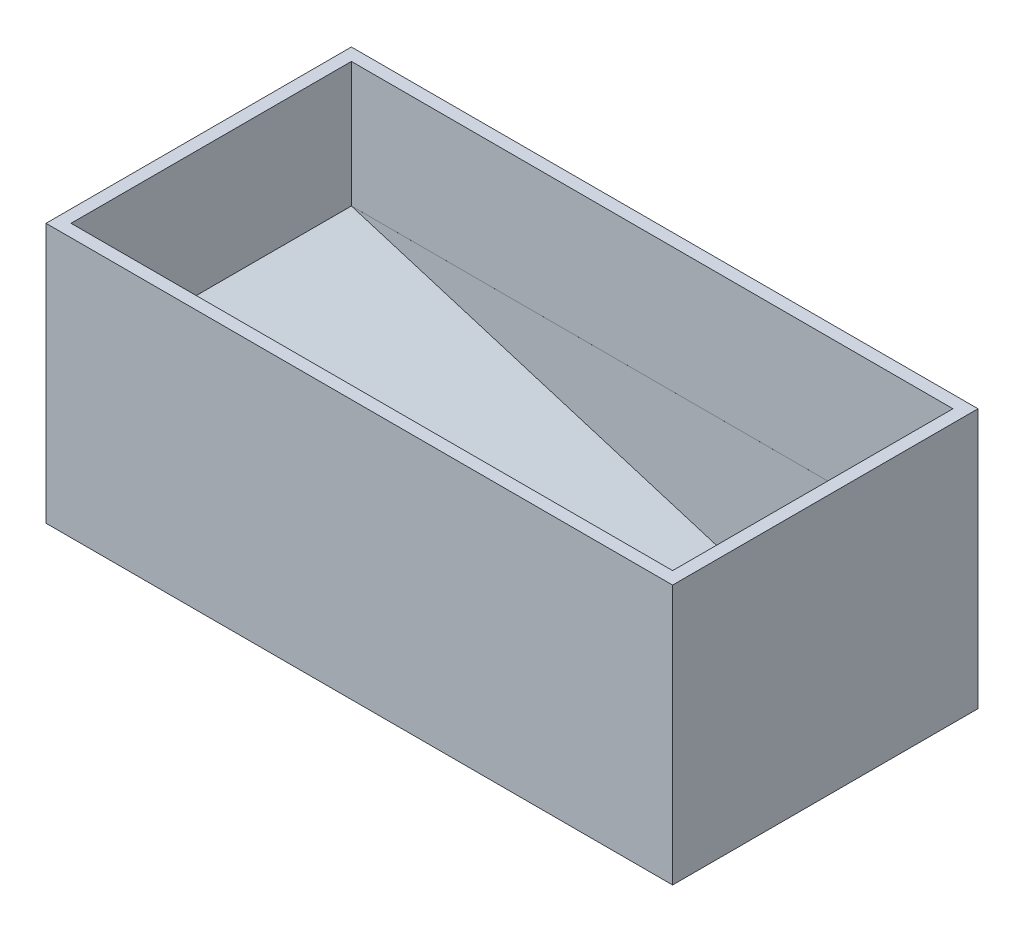
ISO-10303-21;
HEADER;
FILE_DESCRIPTION(('STEP AP214'),'2;1');
FILE_NAME('part.step','',(''),(''),'','','');
FILE_SCHEMA(('AUTOMOTIVE_DESIGN { 1 0 10303 214 1 1 1 1 }'));
ENDSEC;
DATA;
#1=APPLICATION_CONTEXT('core data for automotive mechanical design processes');
#2=APPLICATION_PROTOCOL_DEFINITION('international standard','automotive_design',2000,#1);
#3=PRODUCT_CONTEXT('',#1,'mechanical');
#4=PRODUCT('Part','Part','',(#3));
#5=PRODUCT_RELATED_PRODUCT_CATEGORY('part','',(#4));
#6=PRODUCT_DEFINITION_FORMATION('','',#4);
#7=PRODUCT_DEFINITION_CONTEXT('part definition',#1,'design');
#8=PRODUCT_DEFINITION('design','',#6,#7);
#9=PRODUCT_DEFINITION_SHAPE('','',#8);
#10=(LENGTH_UNIT() NAMED_UNIT(*) SI_UNIT(.MILLI.,.METRE.));
#11=(NAMED_UNIT(*) PLANE_ANGLE_UNIT() SI_UNIT($,.RADIAN.));
#12=(NAMED_UNIT(*) SI_UNIT($,.STERADIAN.) SOLID_ANGLE_UNIT());
#13=UNCERTAINTY_MEASURE_WITH_UNIT(LENGTH_MEASURE(1.E-05),#10,'distance_accuracy_value','');
#14=(GEOMETRIC_REPRESENTATION_CONTEXT(3) GLOBAL_UNCERTAINTY_ASSIGNED_CONTEXT((#13)) GLOBAL_UNIT_ASSIGNED_CONTEXT((#10,
#11,#12)) REPRESENTATION_CONTEXT('',''));
#15=CARTESIAN_POINT('',(0.,0.,0.));
#16=DIRECTION('',(0.,0.,1.));
#17=DIRECTION('',(1.,0.,0.));
#18=AXIS2_PLACEMENT_3D('',#15,#16,#17);
#19=CARTESIAN_POINT('',(0.,40.,-4.05));
#20=DIRECTION('',(0.300004064238839,0.953937923263447,0.));
#21=DIRECTION('',(-0.953937923263448,0.300004064238839,0.));
#22=AXIS2_PLACEMENT_3D('',#19,#20,#21);
#23=PLANE('',#22);
#24=DIRECTION('',(0.,0.,-1.));
#25=VECTOR('',#24,1.);
#26=CARTESIAN_POINT('',(120.8305,1.99999999999998,-83.58));
#27=LINE('',#26,#25);
#28=CARTESIAN_POINT('',(120.8305,1.99999999999999,-83.58));
#29=VERTEX_POINT('',#28);
#30=CARTESIAN_POINT('',(120.8305,1.99999999999998,-93.58));
#31=VERTEX_POINT('',#30);
#32=EDGE_CURVE('E48',#29,#31,#27,.T.);
#33=ORIENTED_EDGE('',*,*,#32,.F.);
#34=DIRECTION('',(-0.953937923263447,0.300004064238839,0.));
#35=VECTOR('',#34,1.);
#36=CARTESIAN_POINT('',(120.8305,1.99999999999998,-83.58));
#37=LINE('',#36,#35);
#38=CARTESIAN_POINT('',(127.19,0.,-83.58));
#39=VERTEX_POINT('',#38);
#40=EDGE_CURVE('E52',#39,#29,#37,.T.);
#41=ORIENTED_EDGE('',*,*,#40,.F.);
#42=DIRECTION('',(0.,0.,-1.));
#43=VECTOR('',#42,1.);
#44=CARTESIAN_POINT('',(127.19,0.,-4.05));
#45=LINE('',#44,#43);
#46=CARTESIAN_POINT('',(127.19,0.,-14.05));
#47=VERTEX_POINT('',#46);
#48=EDGE_CURVE('E222',#47,#39,#45,.T.);
#49=ORIENTED_EDGE('',*,*,#48,.F.);
#50=DIRECTION('',(0.953937923263447,-0.300004064238839,0.));
#51=VECTOR('',#50,1.);
#52=CARTESIAN_POINT('',(120.8305,2.,-14.05));
#53=LINE('',#52,#51);
#54=CARTESIAN_POINT('',(120.8305,2.,-14.05));
#55=VERTEX_POINT('',#54);
#56=EDGE_CURVE('E203',#55,#47,#53,.T.);
#57=ORIENTED_EDGE('',*,*,#56,.F.);
#58=DIRECTION('',(0.,0.,1.));
#59=VECTOR('',#58,1.);
#60=CARTESIAN_POINT('',(120.8305,2.,-14.05));
#61=LINE('',#60,#59);
#62=CARTESIAN_POINT('',(120.8305,2.,-4.05));
#63=VERTEX_POINT('',#62);
#64=EDGE_CURVE('E205',#55,#63,#61,.T.);
#65=ORIENTED_EDGE('',*,*,#64,.T.);
#66=DIRECTION('',(0.953937923263447,-0.300004064238839,0.));
#67=VECTOR('',#66,1.);
#68=CARTESIAN_POINT('',(0.,40.,-4.05));
#69=LINE('',#68,#67);
#70=CARTESIAN_POINT('',(0.,40.,-4.05));
#71=VERTEX_POINT('',#70);
#72=EDGE_CURVE('E218',#71,#63,#69,.T.);
#73=ORIENTED_EDGE('',*,*,#72,.F.);
#74=DIRECTION('',(0.,0.,-1.));
#75=VECTOR('',#74,1.);
#76=CARTESIAN_POINT('',(0.,40.,-4.05));
#77=LINE('',#76,#75);
#78=CARTESIAN_POINT('',(0.,40.,-93.58));
#79=VERTEX_POINT('',#78);
#80=EDGE_CURVE('E221',#71,#79,#77,.T.);
#81=ORIENTED_EDGE('',*,*,#80,.T.);
#82=DIRECTION('',(-0.953937923263447,0.300004064238839,0.));
#83=VECTOR('',#82,1.);
#84=CARTESIAN_POINT('',(0.,40.,-93.58));
#85=LINE('',#84,#83);
#86=EDGE_CURVE('E214',#31,#79,#85,.T.);
#87=ORIENTED_EDGE('',*,*,#86,.F.);
#88=EDGE_LOOP('',(#33,#41,#49,#57,#65,#73,#81,#87));
#89=FACE_BOUND('',#88,.T.);
#90=ADVANCED_FACE('F33',(#89),#23,.F.);
#91=CARTESIAN_POINT('',(-13.5001828907477,-2.92720654685515,-93.58));
#92=DIRECTION('',(0.,0.,-1.));
#93=DIRECTION('',(-1.,0.,0.));
#94=AXIS2_PLACEMENT_3D('',#91,#92,#93);
#95=PLANE('',#94);
#96=DIRECTION('',(-1.,0.,0.));
#97=VECTOR('',#96,1.);
#98=CARTESIAN_POINT('',(0.,1.99999999999998,-93.58));
#99=LINE('',#98,#97);
#100=CARTESIAN_POINT('',(0.,1.99999999999998,-93.58));
#101=VERTEX_POINT('',#100);
#102=EDGE_CURVE('E182',#31,#101,#99,.T.);
#103=ORIENTED_EDGE('',*,*,#102,.F.);
#104=ORIENTED_EDGE('',*,*,#86,.T.);
#105=DIRECTION('',(0.,-1.,0.));
#106=VECTOR('',#105,1.);
#107=CARTESIAN_POINT('',(0.,-2.92720654685515,-93.58));
#108=LINE('',#107,#106);
#109=EDGE_CURVE('E212',#79,#101,#108,.T.);
#110=ORIENTED_EDGE('',*,*,#109,.T.);
#111=EDGE_LOOP('',(#103,#104,#110));
#112=FACE_BOUND('',#111,.T.);
#113=ADVANCED_FACE('F378',(#112),#95,.F.);
#114=CARTESIAN_POINT('',(0.,0.,-4.05));
#115=DIRECTION('',(0.,0.,-1.));
#116=DIRECTION('',(-1.,0.,0.));
#117=AXIS2_PLACEMENT_3D('',#114,#115,#116);
#118=PLANE('',#117);
#119=ORIENTED_EDGE('',*,*,#72,.T.);
#120=DIRECTION('',(1.,0.,0.));
#121=VECTOR('',#120,1.);
#122=CARTESIAN_POINT('',(0.,2.,-4.05));
#123=LINE('',#122,#121);
#124=CARTESIAN_POINT('',(0.,2.,-4.05));
#125=VERTEX_POINT('',#124);
#126=EDGE_CURVE('E195',#125,#63,#123,.T.);
#127=ORIENTED_EDGE('',*,*,#126,.F.);
#128=DIRECTION('',(0.,1.,0.));
#129=VECTOR('',#128,1.);
#130=CARTESIAN_POINT('',(0.,0.,-4.05));
#131=LINE('',#130,#129);
#132=EDGE_CURVE('E216',#125,#71,#131,.T.);
#133=ORIENTED_EDGE('',*,*,#132,.T.);
#134=EDGE_LOOP('',(#119,#127,#133));
#135=FACE_BOUND('',#134,.T.);
#136=ADVANCED_FACE('F383',(#135),#118,.T.);
#137=CARTESIAN_POINT('',(0.,43.,0.));
#138=DIRECTION('',(0.,-1.,0.));
#139=DIRECTION('',(0.,0.,-1.));
#140=AXIS2_PLACEMENT_3D('',#137,#138,#139);
#141=PLANE('',#140);
#142=DIRECTION('',(0.,0.,1.));
#143=VECTOR('',#142,1.);
#144=CARTESIAN_POINT('',(196.209255975504,43.,-4.00494715810851));
#145=LINE('',#144,#143);
#146=CARTESIAN_POINT('',(196.209255975504,43.,-93.5820259850004));
#147=VERTEX_POINT('',#146);
#148=CARTESIAN_POINT('',(196.209255975504,43.,-93.58));
#149=VERTEX_POINT('',#148);
#150=EDGE_CURVE('E230',#147,#149,#145,.T.);
#151=ORIENTED_EDGE('',*,*,#150,.F.);
#152=DIRECTION('',(1.,0.,0.));
#153=VECTOR('',#152,1.);
#154=CARTESIAN_POINT('',(200.21,43.,-93.5820259850004));
#155=LINE('',#154,#153);
#156=CARTESIAN_POINT('',(3.99788742285523,43.,-93.5820259850004));
#157=VERTEX_POINT('',#156);
#158=EDGE_CURVE('E234',#157,#147,#155,.T.);
#159=ORIENTED_EDGE('',*,*,#158,.F.);
#160=DIRECTION('',(0.,0.,-1.));
#161=VECTOR('',#160,1.);
#162=CARTESIAN_POINT('',(3.99788742285523,43.,-4.00494715810851));
#163=LINE('',#162,#161);
#164=CARTESIAN_POINT('',(3.99788742285523,43.,-4.00494715810851));
#165=VERTEX_POINT('',#164);
#166=EDGE_CURVE('E238',#165,#157,#163,.T.);
#167=ORIENTED_EDGE('',*,*,#166,.F.);
#168=DIRECTION('',(-1.,0.,0.));
#169=VECTOR('',#168,1.);
#170=CARTESIAN_POINT('',(200.21,43.,-4.00494715810851));
#171=LINE('',#170,#169);
#172=CARTESIAN_POINT('',(4.,43.,-4.00494715810851));
#173=VERTEX_POINT('',#172);
#174=EDGE_CURVE('E263',#173,#165,#171,.T.);
#175=ORIENTED_EDGE('',*,*,#174,.F.);
#176=DIRECTION('',(0.,0.,1.));
#177=VECTOR('',#176,1.);
#178=CARTESIAN_POINT('',(4.,43.,-4.));
#179=LINE('',#178,#177);
#180=CARTESIAN_POINT('',(4.,43.,-93.58));
#181=VERTEX_POINT('',#180);
#182=EDGE_CURVE('E273',#181,#173,#179,.T.);
#183=ORIENTED_EDGE('',*,*,#182,.F.);
#184=DIRECTION('',(-1.,0.,0.));
#185=VECTOR('',#184,1.);
#186=CARTESIAN_POINT('',(135.19,43.,-93.58));
#187=LINE('',#186,#185);
#188=EDGE_CURVE('E291',#149,#181,#187,.T.);
#189=ORIENTED_EDGE('',*,*,#188,.F.);
#190=EDGE_LOOP('',(#151,#159,#167,#175,#183,#189));
#191=FACE_BOUND('',#190,.T.);
#192=ADVANCED_FACE('F336',(#191),#141,.F.);
#193=CARTESIAN_POINT('',(200.21,83.,-4.00494715810851));
#194=DIRECTION('',(0.,0.,1.));
#195=DIRECTION('',(1.,0.,0.));
#196=AXIS2_PLACEMENT_3D('',#193,#194,#195);
#197=PLANE('',#196);
#198=DIRECTION('',(0.,-1.,0.));
#199=VECTOR('',#198,1.);
#200=CARTESIAN_POINT('',(196.209255975504,83.,-4.00494715810851));
#201=LINE('',#200,#199);
#202=CARTESIAN_POINT('',(196.209255975504,83.,-4.00494715810851));
#203=VERTEX_POINT('',#202);
#204=CARTESIAN_POINT('',(196.209255975504,43.,-4.00494715810851));
#205=VERTEX_POINT('',#204);
#206=EDGE_CURVE('E229',#203,#205,#201,.T.);
#207=ORIENTED_EDGE('',*,*,#206,.T.);
#208=EDGE_CURVE('E250',#205,#173,#171,.T.);
#209=ORIENTED_EDGE('',*,*,#208,.T.);
#210=ORIENTED_EDGE('',*,*,#174,.T.);
#211=DIRECTION('',(0.,-1.,0.));
#212=VECTOR('',#211,1.);
#213=CARTESIAN_POINT('',(3.99788742285523,83.,-4.00494715810851));
#214=LINE('',#213,#212);
#215=CARTESIAN_POINT('',(3.99788742285523,83.,-4.00494715810851));
#216=VERTEX_POINT('',#215);
#217=EDGE_CURVE('E246',#216,#165,#214,.T.);
#218=ORIENTED_EDGE('',*,*,#217,.F.);
#219=DIRECTION('',(-1.,0.,0.));
#220=VECTOR('',#219,1.);
#221=CARTESIAN_POINT('',(200.21,83.,-4.00494715810851));
#222=LINE('',#221,#220);
#223=EDGE_CURVE('E253',#203,#216,#222,.T.);
#224=ORIENTED_EDGE('',*,*,#223,.F.);
#225=EDGE_LOOP('',(#207,#209,#210,#218,#224));
#226=FACE_BOUND('',#225,.T.);
#227=ADVANCED_FACE('F329',(#226),#197,.F.);
#228=CARTESIAN_POINT('',(200.21,83.,-93.5820259850004));
#229=DIRECTION('',(0.,0.,-1.));
#230=DIRECTION('',(-1.,0.,0.));
#231=AXIS2_PLACEMENT_3D('',#228,#229,#230);
#232=PLANE('',#231);
#233=DIRECTION('',(0.,-1.,0.));
#234=VECTOR('',#233,1.);
#235=CARTESIAN_POINT('',(196.209255975504,83.,-93.5820259850004));
#236=LINE('',#235,#234);
#237=CARTESIAN_POINT('',(196.209255975504,83.,-93.5820259850004));
#238=VERTEX_POINT('',#237);
#239=EDGE_CURVE('E11',#238,#147,#236,.T.);
#240=ORIENTED_EDGE('',*,*,#239,.F.);
#241=DIRECTION('',(1.,0.,0.));
#242=VECTOR('',#241,1.);
#243=CARTESIAN_POINT('',(200.21,83.,-93.5820259850004));
#244=LINE('',#243,#242);
#245=CARTESIAN_POINT('',(3.99788742285523,83.,-93.5820259850004));
#246=VERTEX_POINT('',#245);
#247=EDGE_CURVE('E235',#246,#238,#244,.T.);
#248=ORIENTED_EDGE('',*,*,#247,.F.);
#249=DIRECTION('',(0.,-1.,0.));
#250=VECTOR('',#249,1.);
#251=CARTESIAN_POINT('',(3.99788742285523,83.,-93.5820259850004));
#252=LINE('',#251,#250);
#253=EDGE_CURVE('E41',#246,#157,#252,.T.);
#254=ORIENTED_EDGE('',*,*,#253,.T.);
#255=ORIENTED_EDGE('',*,*,#158,.T.);
#256=EDGE_LOOP('',(#240,#248,#254,#255));
#257=FACE_BOUND('',#256,.T.);
#258=ADVANCED_FACE('F360',(#257),#232,.F.);
#259=CARTESIAN_POINT('',(3.99788742285523,83.,-4.00494715810851));
#260=DIRECTION('',(-1.,0.,0.));
#261=DIRECTION('',(0.,0.,1.));
#262=AXIS2_PLACEMENT_3D('',#259,#260,#261);
#263=PLANE('',#262);
#264=ORIENTED_EDGE('',*,*,#253,.F.);
#265=DIRECTION('',(0.,0.,-1.));
#266=VECTOR('',#265,1.);
#267=CARTESIAN_POINT('',(3.99788742285523,83.,-4.00494715810851));
#268=LINE('',#267,#266);
#269=EDGE_CURVE('E241',#216,#246,#268,.T.);
#270=ORIENTED_EDGE('',*,*,#269,.F.);
#271=ORIENTED_EDGE('',*,*,#217,.T.);
#272=ORIENTED_EDGE('',*,*,#166,.T.);
#273=EDGE_LOOP('',(#264,#270,#271,#272));
#274=FACE_BOUND('',#273,.T.);
#275=ADVANCED_FACE('F366',(#274),#263,.F.);
#276=CARTESIAN_POINT('',(0.,3.,0.));
#277=DIRECTION('',(0.,-1.,0.));
#278=DIRECTION('',(0.,0.,-1.));
#279=AXIS2_PLACEMENT_3D('',#276,#277,#278);
#280=PLANE('',#279);
#281=CARTESIAN_POINT('',(165.7,3.,-49.98));
#282=DIRECTION('',(0.,-1.,0.));
#283=DIRECTION('',(0.,0.,-1.));
#284=AXIS2_PLACEMENT_3D('',#281,#282,#283);
#285=CIRCLE('',#284,30.26);
#286=CARTESIAN_POINT('',(165.7,3.,-80.24));
#287=VERTEX_POINT('',#286);
#288=EDGE_CURVE('E297',#287,#287,#285,.F.);
#289=ORIENTED_EDGE('',*,*,#288,.F.);
#290=EDGE_LOOP('',(#289));
#291=FACE_BOUND('',#290,.T.);
#292=DIRECTION('',(0.,0.,-1.));
#293=VECTOR('',#292,1.);
#294=CARTESIAN_POINT('',(135.19,3.00000000000001,-1.58));
#295=LINE('',#294,#293);
#296=CARTESIAN_POINT('',(135.19,2.99999999999999,-4.));
#297=VERTEX_POINT('',#296);
#298=CARTESIAN_POINT('',(135.19,2.99999999999999,-93.58));
#299=VERTEX_POINT('',#298);
#300=EDGE_CURVE('E266',#297,#299,#295,.T.);
#301=ORIENTED_EDGE('',*,*,#300,.F.);
#302=DIRECTION('',(1.,0.,0.));
#303=VECTOR('',#302,1.);
#304=CARTESIAN_POINT('',(135.19,3.,-4.));
#305=LINE('',#304,#303);
#306=CARTESIAN_POINT('',(196.21,3.,-4.));
#307=VERTEX_POINT('',#306);
#308=EDGE_CURVE('E277',#297,#307,#305,.T.);
#309=ORIENTED_EDGE('',*,*,#308,.T.);
#310=DIRECTION('',(0.,0.,-1.));
#311=VECTOR('',#310,1.);
#312=CARTESIAN_POINT('',(196.21,3.,-4.));
#313=LINE('',#312,#311);
#314=CARTESIAN_POINT('',(196.21,3.,-93.58));
#315=VERTEX_POINT('',#314);
#316=EDGE_CURVE('E279',#307,#315,#313,.T.);
#317=ORIENTED_EDGE('',*,*,#316,.T.);
#318=DIRECTION('',(-1.,0.,0.));
#319=VECTOR('',#318,1.);
#320=CARTESIAN_POINT('',(135.19,3.,-93.58));
#321=LINE('',#320,#319);
#322=EDGE_CURVE('E283',#315,#299,#321,.T.);
#323=ORIENTED_EDGE('',*,*,#322,.T.);
#324=EDGE_LOOP('',(#301,#309,#317,#323));
#325=FACE_BOUND('',#324,.T.);
#326=ADVANCED_FACE('F353',(#291,#325),#280,.F.);
#327=CARTESIAN_POINT('',(135.19,3.,-93.58));
#328=DIRECTION('',(0.,0.,-1.));
#329=DIRECTION('',(-1.,0.,0.));
#330=AXIS2_PLACEMENT_3D('',#327,#328,#329);
#331=PLANE('',#330);
#332=DIRECTION('',(-0.95652629480424,0.291646099490583,0.));
#333=VECTOR('',#332,1.);
#334=CARTESIAN_POINT('',(135.19,3.00000000000001,-93.58));
#335=LINE('',#334,#333);
#336=EDGE_CURVE('E261',#299,#181,#335,.T.);
#337=ORIENTED_EDGE('',*,*,#336,.F.);
#338=ORIENTED_EDGE('',*,*,#322,.F.);
#339=DIRECTION('',(0.,1.,0.));
#340=VECTOR('',#339,1.);
#341=CARTESIAN_POINT('',(196.21,3.,-93.58));
#342=LINE('',#341,#340);
#343=CARTESIAN_POINT('',(196.21,43.,-93.58));
#344=VERTEX_POINT('',#343);
#345=EDGE_CURVE('E294',#315,#344,#342,.T.);
#346=ORIENTED_EDGE('',*,*,#345,.T.);
#347=EDGE_CURVE('E280',#344,#149,#187,.T.);
#348=ORIENTED_EDGE('',*,*,#347,.T.);
#349=ORIENTED_EDGE('',*,*,#188,.T.);
#350=EDGE_LOOP('',(#337,#338,#346,#348,#349));
#351=FACE_BOUND('',#350,.T.);
#352=ADVANCED_FACE('F356',(#351),#331,.F.);
#353=CARTESIAN_POINT('',(135.19,3.,-4.));
#354=DIRECTION('',(0.,0.,1.));
#355=DIRECTION('',(1.,0.,0.));
#356=AXIS2_PLACEMENT_3D('',#353,#354,#355);
#357=PLANE('',#356);
#358=DIRECTION('',(0.956526294804241,-0.291646099490583,0.));
#359=VECTOR('',#358,1.);
#360=CARTESIAN_POINT('',(135.19,3.00000000000001,-4.));
#361=LINE('',#360,#359);
#362=CARTESIAN_POINT('',(4.,43.,-4.));
#363=VERTEX_POINT('',#362);
#364=EDGE_CURVE('E269',#363,#297,#361,.T.);
#365=ORIENTED_EDGE('',*,*,#364,.F.);
#366=DIRECTION('',(1.,0.,0.));
#367=VECTOR('',#366,1.);
#368=CARTESIAN_POINT('',(135.19,43.,-4.));
#369=LINE('',#368,#367);
#370=CARTESIAN_POINT('',(196.21,43.,-4.));
#371=VERTEX_POINT('',#370);
#372=EDGE_CURVE('E276',#363,#371,#369,.T.);
#373=ORIENTED_EDGE('',*,*,#372,.T.);
#374=DIRECTION('',(0.,1.,0.));
#375=VECTOR('',#374,1.);
#376=CARTESIAN_POINT('',(196.21,3.,-4.));
#377=LINE('',#376,#375);
#378=EDGE_CURVE('E286',#307,#371,#377,.T.);
#379=ORIENTED_EDGE('',*,*,#378,.F.);
#380=ORIENTED_EDGE('',*,*,#308,.F.);
#381=EDGE_LOOP('',(#365,#373,#379,#380));
#382=FACE_BOUND('',#381,.T.);
#383=ADVANCED_FACE('F349',(#382),#357,.F.);
#384=CARTESIAN_POINT('',(0.,43.,0.));
#385=DIRECTION('',(1.,0.,0.));
#386=DIRECTION('',(0.,0.,-1.));
#387=AXIS2_PLACEMENT_3D('',#384,#385,#386);
#388=PLANE('',#387);
#389=DIRECTION('',(0.,-1.,0.));
#390=VECTOR('',#389,1.);
#391=CARTESIAN_POINT('',(0.,43.,-97.58));
#392=LINE('',#391,#390);
#393=CARTESIAN_POINT('',(0.,83.,-97.58));
#394=VERTEX_POINT('',#393);
#395=CARTESIAN_POINT('',(0.,0.,-97.58));
#396=VERTEX_POINT('',#395);
#397=EDGE_CURVE('E310',#394,#396,#392,.T.);
#398=ORIENTED_EDGE('',*,*,#397,.T.);
#399=DIRECTION('',(0.,0.,1.));
#400=VECTOR('',#399,1.);
#401=CARTESIAN_POINT('',(0.,0.,0.));
#402=LINE('',#401,#400);
#403=CARTESIAN_POINT('',(0.,0.,-83.58));
#404=VERTEX_POINT('',#403);
#405=EDGE_CURVE('E188',#396,#404,#402,.T.);
#406=ORIENTED_EDGE('',*,*,#405,.T.);
#407=DIRECTION('',(0.,-1.,0.));
#408=VECTOR('',#407,1.);
#409=CARTESIAN_POINT('',(0.,0.,-83.58));
#410=LINE('',#409,#408);
#411=CARTESIAN_POINT('',(0.,1.99999999999998,-83.58));
#412=VERTEX_POINT('',#411);
#413=EDGE_CURVE('E174',#412,#404,#410,.T.);
#414=ORIENTED_EDGE('',*,*,#413,.F.);
#415=DIRECTION('',(0.,0.,-1.));
#416=VECTOR('',#415,1.);
#417=CARTESIAN_POINT('',(0.,1.99999999999998,-83.58));
#418=LINE('',#417,#416);
#419=EDGE_CURVE('E180',#412,#101,#418,.T.);
#420=ORIENTED_EDGE('',*,*,#419,.T.);
#421=ORIENTED_EDGE('',*,*,#109,.F.);
#422=ORIENTED_EDGE('',*,*,#80,.F.);
#423=ORIENTED_EDGE('',*,*,#132,.F.);
#424=DIRECTION('',(0.,0.,1.));
#425=VECTOR('',#424,1.);
#426=CARTESIAN_POINT('',(0.,2.,-14.05));
#427=LINE('',#426,#425);
#428=CARTESIAN_POINT('',(0.,2.,-14.05));
#429=VERTEX_POINT('',#428);
#430=EDGE_CURVE('E209',#429,#125,#427,.T.);
#431=ORIENTED_EDGE('',*,*,#430,.F.);
#432=DIRECTION('',(0.,1.,0.));
#433=VECTOR('',#432,1.);
#434=CARTESIAN_POINT('',(0.,0.,-14.05));
#435=LINE('',#434,#433);
#436=CARTESIAN_POINT('',(0.,0.,-14.05));
#437=VERTEX_POINT('',#436);
#438=EDGE_CURVE('E199',#437,#429,#435,.T.);
#439=ORIENTED_EDGE('',*,*,#438,.F.);
#440=DIRECTION('',(0.,0.,1.));
#441=VECTOR('',#440,1.);
#442=CARTESIAN_POINT('',(0.,0.,0.));
#443=LINE('',#442,#441);
#444=CARTESIAN_POINT('',(0.,0.,0.));
#445=VERTEX_POINT('',#444);
#446=EDGE_CURVE('E302',#437,#445,#443,.T.);
#447=ORIENTED_EDGE('',*,*,#446,.T.);
#448=DIRECTION('',(0.,-1.,0.));
#449=VECTOR('',#448,1.);
#450=CARTESIAN_POINT('',(0.,43.,0.));
#451=LINE('',#450,#449);
#452=CARTESIAN_POINT('',(0.,83.,0.));
#453=VERTEX_POINT('',#452);
#454=EDGE_CURVE('E318',#453,#445,#451,.T.);
#455=ORIENTED_EDGE('',*,*,#454,.F.);
#456=DIRECTION('',(0.,0.,1.));
#457=VECTOR('',#456,1.);
#458=CARTESIAN_POINT('',(0.,83.,0.));
#459=LINE('',#458,#457);
#460=EDGE_CURVE('E255',#394,#453,#459,.T.);
#461=ORIENTED_EDGE('',*,*,#460,.F.);
#462=EDGE_LOOP('',(#398,#406,#414,#420,#421,#422,#423,#431,#439,#447,#455,#461));
#463=FACE_BOUND('',#462,.T.);
#464=ADVANCED_FACE('F35',(#463),#388,.F.);
#465=CARTESIAN_POINT('',(0.,43.,0.));
#466=DIRECTION('',(0.,0.,-1.));
#467=DIRECTION('',(-1.,0.,0.));
#468=AXIS2_PLACEMENT_3D('',#465,#466,#467);
#469=PLANE('',#468);
#470=DIRECTION('',(1.,0.,0.));
#471=VECTOR('',#470,1.);
#472=CARTESIAN_POINT('',(0.,0.,0.));
#473=LINE('',#472,#471);
#474=CARTESIAN_POINT('',(200.21,0.,0.));
#475=VERTEX_POINT('',#474);
#476=EDGE_CURVE('E304',#445,#475,#473,.T.);
#477=ORIENTED_EDGE('',*,*,#476,.T.);
#478=DIRECTION('',(0.,-1.,0.));
#479=VECTOR('',#478,1.);
#480=CARTESIAN_POINT('',(200.21,43.,0.));
#481=LINE('',#480,#479);
#482=CARTESIAN_POINT('',(200.21,83.,0.));
#483=VERTEX_POINT('',#482);
#484=EDGE_CURVE('E315',#483,#475,#481,.T.);
#485=ORIENTED_EDGE('',*,*,#484,.F.);
#486=DIRECTION('',(1.,0.,0.));
#487=VECTOR('',#486,1.);
#488=CARTESIAN_POINT('',(200.21,83.,0.));
#489=LINE('',#488,#487);
#490=EDGE_CURVE('E258',#453,#483,#489,.T.);
#491=ORIENTED_EDGE('',*,*,#490,.F.);
#492=ORIENTED_EDGE('',*,*,#454,.T.);
#493=EDGE_LOOP('',(#477,#485,#491,#492));
#494=FACE_BOUND('',#493,.T.);
#495=ADVANCED_FACE('F432',(#494),#469,.F.);
#496=CARTESIAN_POINT('',(200.21,43.,0.));
#497=DIRECTION('',(-1.,0.,0.));
#498=DIRECTION('',(0.,0.,1.));
#499=AXIS2_PLACEMENT_3D('',#496,#497,#498);
#500=PLANE('',#499);
#501=DIRECTION('',(0.,-1.,0.));
#502=VECTOR('',#501,1.);
#503=CARTESIAN_POINT('',(200.21,43.,-97.58));
#504=LINE('',#503,#502);
#505=CARTESIAN_POINT('',(200.21,83.,-97.58));
#506=VERTEX_POINT('',#505);
#507=CARTESIAN_POINT('',(200.21,0.,-97.58));
#508=VERTEX_POINT('',#507);
#509=EDGE_CURVE('E312',#506,#508,#504,.T.);
#510=ORIENTED_EDGE('',*,*,#509,.F.);
#511=DIRECTION('',(0.,0.,-1.));
#512=VECTOR('',#511,1.);
#513=CARTESIAN_POINT('',(200.21,83.,0.));
#514=LINE('',#513,#512);
#515=EDGE_CURVE('E251',#483,#506,#514,.T.);
#516=ORIENTED_EDGE('',*,*,#515,.F.);
#517=ORIENTED_EDGE('',*,*,#484,.T.);
#518=DIRECTION('',(0.,0.,-1.));
#519=VECTOR('',#518,1.);
#520=CARTESIAN_POINT('',(200.21,0.,0.));
#521=LINE('',#520,#519);
#522=EDGE_CURVE('E306',#475,#508,#521,.T.);
#523=ORIENTED_EDGE('',*,*,#522,.T.);
#524=EDGE_LOOP('',(#510,#516,#517,#523));
#525=FACE_BOUND('',#524,.T.);
#526=ADVANCED_FACE('F429',(#525),#500,.F.);
#527=CARTESIAN_POINT('',(0.,43.,-97.58));
#528=DIRECTION('',(0.,0.,1.));
#529=DIRECTION('',(1.,0.,0.));
#530=AXIS2_PLACEMENT_3D('',#527,#528,#529);
#531=PLANE('',#530);
#532=DIRECTION('',(-1.,0.,0.));
#533=VECTOR('',#532,1.);
#534=CARTESIAN_POINT('',(0.,0.,-97.58));
#535=LINE('',#534,#533);
#536=EDGE_CURVE('E308',#508,#396,#535,.T.);
#537=ORIENTED_EDGE('',*,*,#536,.T.);
#538=ORIENTED_EDGE('',*,*,#397,.F.);
#539=DIRECTION('',(-1.,0.,0.));
#540=VECTOR('',#539,1.);
#541=CARTESIAN_POINT('',(0.,83.,-97.58));
#542=LINE('',#541,#540);
#543=EDGE_CURVE('E244',#506,#394,#542,.T.);
#544=ORIENTED_EDGE('',*,*,#543,.F.);
#545=ORIENTED_EDGE('',*,*,#509,.T.);
#546=EDGE_LOOP('',(#537,#538,#544,#545));
#547=FACE_BOUND('',#546,.T.);
#548=ADVANCED_FACE('F425',(#547),#531,.F.);
#549=CARTESIAN_POINT('',(0.,0.,0.));
#550=DIRECTION('',(0.,-1.,0.));
#551=DIRECTION('',(0.,0.,-1.));
#552=AXIS2_PLACEMENT_3D('',#549,#550,#551);
#553=PLANE('',#552);
#554=DIRECTION('',(-1.,0.,0.));
#555=VECTOR('',#554,1.);
#556=CARTESIAN_POINT('',(127.19,0.,-14.05));
#557=LINE('',#556,#555);
#558=EDGE_CURVE('E196',#47,#437,#557,.T.);
#559=ORIENTED_EDGE('',*,*,#558,.F.);
#560=ORIENTED_EDGE('',*,*,#48,.T.);
#561=DIRECTION('',(1.,0.,0.));
#562=VECTOR('',#561,1.);
#563=CARTESIAN_POINT('',(127.19,0.,-83.58));
#564=LINE('',#563,#562);
#565=EDGE_CURVE('E192',#404,#39,#564,.T.);
#566=ORIENTED_EDGE('',*,*,#565,.F.);
#567=ORIENTED_EDGE('',*,*,#405,.F.);
#568=ORIENTED_EDGE('',*,*,#536,.F.);
#569=ORIENTED_EDGE('',*,*,#522,.F.);
#570=ORIENTED_EDGE('',*,*,#476,.F.);
#571=ORIENTED_EDGE('',*,*,#446,.F.);
#572=EDGE_LOOP('',(#559,#560,#566,#567,#568,#569,#570,#571));
#573=FACE_BOUND('',#572,.T.);
#574=CARTESIAN_POINT('',(165.7,0.,-49.98));
#575=DIRECTION('',(0.,1.,0.));
#576=DIRECTION('',(0.,0.,1.));
#577=AXIS2_PLACEMENT_3D('',#574,#575,#576);
#578=CIRCLE('',#577,30.26);
#579=CARTESIAN_POINT('',(165.7,0.,-19.72));
#580=VERTEX_POINT('',#579);
#581=EDGE_CURVE('E299',#580,#580,#578,.T.);
#582=ORIENTED_EDGE('',*,*,#581,.T.);
#583=EDGE_LOOP('',(#582));
#584=FACE_BOUND('',#583,.T.);
#585=ADVANCED_FACE('F419',(#573,#584),#553,.T.);
#586=CARTESIAN_POINT('',(165.7,0.,-49.98));
#587=DIRECTION('',(0.,1.,0.));
#588=DIRECTION('',(0.,0.,1.));
#589=AXIS2_PLACEMENT_3D('',#586,#587,#588);
#590=CYLINDRICAL_SURFACE('',#589,30.26);
#591=ORIENTED_EDGE('',*,*,#288,.T.);
#592=EDGE_LOOP('',(#591));
#593=FACE_BOUND('',#592,.T.);
#594=ORIENTED_EDGE('',*,*,#581,.F.);
#595=EDGE_LOOP('',(#594));
#596=FACE_BOUND('',#595,.T.);
#597=ADVANCED_FACE('F413',(#593,#596),#590,.F.);
#598=CARTESIAN_POINT('',(196.21,3.,-4.));
#599=DIRECTION('',(1.,0.,0.));
#600=DIRECTION('',(0.,0.,-1.));
#601=AXIS2_PLACEMENT_3D('',#598,#599,#600);
#602=PLANE('',#601);
#603=DIRECTION('',(0.,0.,-1.));
#604=VECTOR('',#603,1.);
#605=CARTESIAN_POINT('',(196.21,43.,-4.));
#606=LINE('',#605,#604);
#607=EDGE_CURVE('E289',#371,#344,#606,.T.);
#608=ORIENTED_EDGE('',*,*,#607,.T.);
#609=ORIENTED_EDGE('',*,*,#345,.F.);
#610=ORIENTED_EDGE('',*,*,#316,.F.);
#611=ORIENTED_EDGE('',*,*,#378,.T.);
#612=EDGE_LOOP('',(#608,#609,#610,#611));
#613=FACE_BOUND('',#612,.T.);
#614=ADVANCED_FACE('F407',(#613),#602,.F.);
#615=CARTESIAN_POINT('',(135.19,3.00000000000001,-1.58));
#616=DIRECTION('',(-0.291646099490583,-0.956526294804241,0.));
#617=DIRECTION('',(0.956526294804241,-0.291646099490583,0.));
#618=AXIS2_PLACEMENT_3D('',#615,#616,#617);
#619=PLANE('',#618);
#620=ORIENTED_EDGE('',*,*,#182,.T.);
#621=EDGE_CURVE('E272',#173,#363,#179,.T.);
#622=ORIENTED_EDGE('',*,*,#621,.T.);
#623=ORIENTED_EDGE('',*,*,#364,.T.);
#624=ORIENTED_EDGE('',*,*,#300,.T.);
#625=ORIENTED_EDGE('',*,*,#336,.T.);
#626=EDGE_LOOP('',(#620,#622,#623,#624,#625));
#627=FACE_BOUND('',#626,.T.);
#628=ADVANCED_FACE('F340',(#627),#619,.F.);
#629=CARTESIAN_POINT('',(0.,83.,0.));
#630=DIRECTION('',(0.,1.,0.));
#631=DIRECTION('',(0.,0.,1.));
#632=AXIS2_PLACEMENT_3D('',#629,#630,#631);
#633=PLANE('',#632);
#634=ORIENTED_EDGE('',*,*,#515,.T.);
#635=ORIENTED_EDGE('',*,*,#543,.T.);
#636=ORIENTED_EDGE('',*,*,#460,.T.);
#637=ORIENTED_EDGE('',*,*,#490,.T.);
#638=EDGE_LOOP('',(#634,#635,#636,#637));
#639=FACE_BOUND('',#638,.T.);
#640=ORIENTED_EDGE('',*,*,#247,.T.);
#641=DIRECTION('',(0.,0.,1.));
#642=VECTOR('',#641,1.);
#643=CARTESIAN_POINT('',(196.209255975504,83.,-4.00494715810851));
#644=LINE('',#643,#642);
#645=EDGE_CURVE('E227',#238,#203,#644,.T.);
#646=ORIENTED_EDGE('',*,*,#645,.T.);
#647=ORIENTED_EDGE('',*,*,#223,.T.);
#648=ORIENTED_EDGE('',*,*,#269,.T.);
#649=EDGE_LOOP('',(#640,#646,#647,#648));
#650=FACE_BOUND('',#649,.T.);
#651=ADVANCED_FACE('F362',(#639,#650),#633,.T.);
#652=CARTESIAN_POINT('',(0.,43.,0.));
#653=DIRECTION('',(0.,1.,0.));
#654=DIRECTION('',(0.,0.,1.));
#655=AXIS2_PLACEMENT_3D('',#652,#653,#654);
#656=PLANE('',#655);
#657=ORIENTED_EDGE('',*,*,#621,.F.);
#658=ORIENTED_EDGE('',*,*,#208,.F.);
#659=EDGE_CURVE('E224',#149,#205,#145,.T.);
#660=ORIENTED_EDGE('',*,*,#659,.F.);
#661=ORIENTED_EDGE('',*,*,#347,.F.);
#662=ORIENTED_EDGE('',*,*,#607,.F.);
#663=ORIENTED_EDGE('',*,*,#372,.F.);
#664=EDGE_LOOP('',(#657,#658,#660,#661,#662,#663));
#665=FACE_BOUND('',#664,.T.);
#666=ADVANCED_FACE('F344',(#665),#656,.F.);
#667=CARTESIAN_POINT('',(196.209255975504,83.,-4.00494715810851));
#668=DIRECTION('',(1.,0.,0.));
#669=DIRECTION('',(0.,0.,-1.));
#670=AXIS2_PLACEMENT_3D('',#667,#668,#669);
#671=PLANE('',#670);
#672=ORIENTED_EDGE('',*,*,#645,.F.);
#673=ORIENTED_EDGE('',*,*,#239,.T.);
#674=ORIENTED_EDGE('',*,*,#150,.T.);
#675=ORIENTED_EDGE('',*,*,#659,.T.);
#676=ORIENTED_EDGE('',*,*,#206,.F.);
#677=EDGE_LOOP('',(#672,#673,#674,#675,#676));
#678=FACE_BOUND('',#677,.T.);
#679=ADVANCED_FACE('F388',(#678),#671,.F.);
#680=CARTESIAN_POINT('',(0.,2.,-14.05));
#681=DIRECTION('',(0.,-1.,0.));
#682=DIRECTION('',(1.,0.,0.));
#683=AXIS2_PLACEMENT_3D('',#680,#681,#682);
#684=PLANE('',#683);
#685=ORIENTED_EDGE('',*,*,#126,.T.);
#686=ORIENTED_EDGE('',*,*,#64,.F.);
#687=DIRECTION('',(1.,0.,0.));
#688=VECTOR('',#687,1.);
#689=CARTESIAN_POINT('',(0.,2.,-14.05));
#690=LINE('',#689,#688);
#691=EDGE_CURVE('E201',#429,#55,#690,.T.);
#692=ORIENTED_EDGE('',*,*,#691,.F.);
#693=ORIENTED_EDGE('',*,*,#430,.T.);
#694=EDGE_LOOP('',(#685,#686,#692,#693));
#695=FACE_BOUND('',#694,.T.);
#696=ADVANCED_FACE('F390',(#695),#684,.F.);
#697=CARTESIAN_POINT('',(0.,0.,-14.05));
#698=DIRECTION('',(0.,0.,-1.));
#699=DIRECTION('',(-1.,0.,0.));
#700=AXIS2_PLACEMENT_3D('',#697,#698,#699);
#701=PLANE('',#700);
#702=ORIENTED_EDGE('',*,*,#558,.T.);
#703=ORIENTED_EDGE('',*,*,#438,.T.);
#704=ORIENTED_EDGE('',*,*,#691,.T.);
#705=ORIENTED_EDGE('',*,*,#56,.T.);
#706=EDGE_LOOP('',(#702,#703,#704,#705));
#707=FACE_BOUND('',#706,.T.);
#708=ADVANCED_FACE('F395',(#707),#701,.T.);
#709=CARTESIAN_POINT('',(0.,1.99999999999998,-83.58));
#710=DIRECTION('',(0.,-1.,0.));
#711=DIRECTION('',(1.,0.,0.));
#712=AXIS2_PLACEMENT_3D('',#709,#710,#711);
#713=PLANE('',#712);
#714=ORIENTED_EDGE('',*,*,#102,.T.);
#715=ORIENTED_EDGE('',*,*,#419,.F.);
#716=DIRECTION('',(-1.,0.,0.));
#717=VECTOR('',#716,1.);
#718=CARTESIAN_POINT('',(0.,1.99999999999998,-83.58));
#719=LINE('',#718,#717);
#720=EDGE_CURVE('E169',#29,#412,#719,.T.);
#721=ORIENTED_EDGE('',*,*,#720,.F.);
#722=ORIENTED_EDGE('',*,*,#32,.T.);
#723=EDGE_LOOP('',(#714,#715,#721,#722));
#724=FACE_BOUND('',#723,.T.);
#725=ADVANCED_FACE('F181',(#724),#713,.F.);
#726=CARTESIAN_POINT('',(0.,0.,-83.58));
#727=DIRECTION('',(0.,0.,-1.));
#728=DIRECTION('',(-1.,0.,0.));
#729=AXIS2_PLACEMENT_3D('',#726,#727,#728);
#730=PLANE('',#729);
#731=ORIENTED_EDGE('',*,*,#565,.T.);
#732=ORIENTED_EDGE('',*,*,#40,.T.);
#733=ORIENTED_EDGE('',*,*,#720,.T.);
#734=ORIENTED_EDGE('',*,*,#413,.T.);
#735=EDGE_LOOP('',(#731,#732,#733,#734));
#736=FACE_BOUND('',#735,.T.);
#737=ADVANCED_FACE('F172',(#736),#730,.F.);
#738=CLOSED_SHELL('',(#90,#113,#136,#192,#227,#258,#275,#326,#352,#383,#464,#495,#526,#548,#585,
#597,#614,#628,#651,#666,#679,#696,#708,#725,#737));
#739=MANIFOLD_SOLID_BREP('B2',#738);
#740=ADVANCED_BREP_SHAPE_REPRESENTATION('',(#18,#739),#14);
#741=SHAPE_DEFINITION_REPRESENTATION(#9,#740);
ENDSEC;
END-ISO-10303-21;
